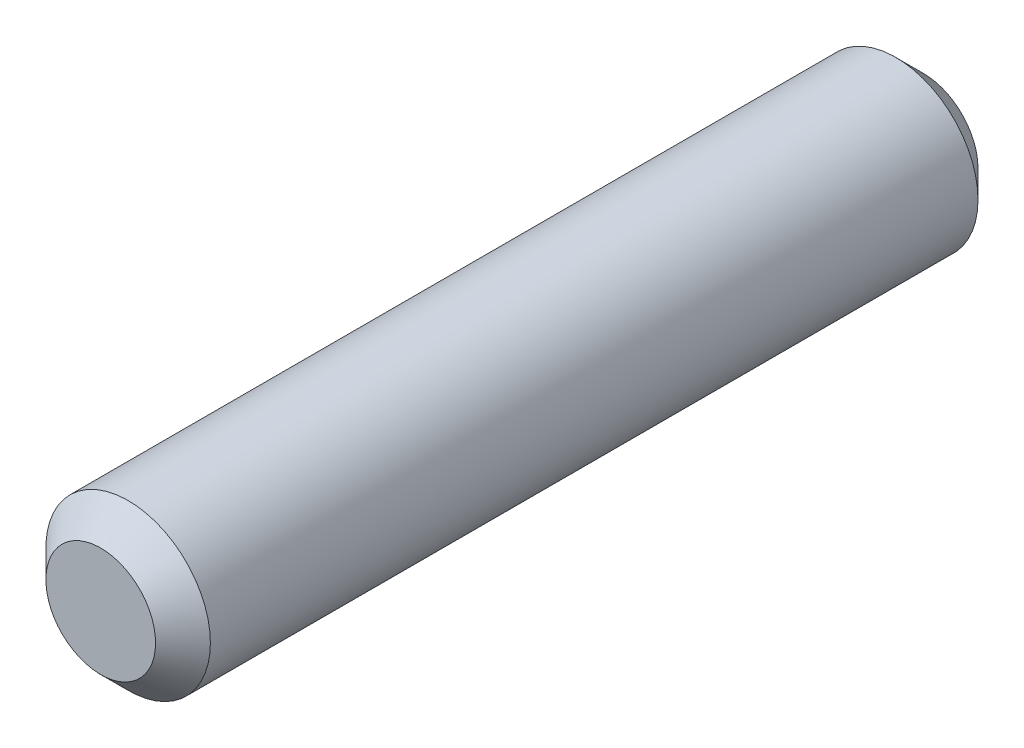
ISO-10303-21;
HEADER;
FILE_DESCRIPTION(('STEP AP214'),'2;1');
FILE_NAME('part.step','',(''),(''),'','','');
FILE_SCHEMA(('AUTOMOTIVE_DESIGN { 1 0 10303 214 1 1 1 1 }'));
ENDSEC;
DATA;
#1=APPLICATION_CONTEXT('core data for automotive mechanical design processes');
#2=APPLICATION_PROTOCOL_DEFINITION('international standard','automotive_design',2000,#1);
#3=PRODUCT_CONTEXT('',#1,'mechanical');
#4=PRODUCT('Part','Part','',(#3));
#5=PRODUCT_RELATED_PRODUCT_CATEGORY('part','',(#4));
#6=PRODUCT_DEFINITION_FORMATION('','',#4);
#7=PRODUCT_DEFINITION_CONTEXT('part definition',#1,'design');
#8=PRODUCT_DEFINITION('design','',#6,#7);
#9=PRODUCT_DEFINITION_SHAPE('','',#8);
#10=(LENGTH_UNIT() NAMED_UNIT(*) SI_UNIT(.MILLI.,.METRE.));
#11=(NAMED_UNIT(*) PLANE_ANGLE_UNIT() SI_UNIT($,.RADIAN.));
#12=(NAMED_UNIT(*) SI_UNIT($,.STERADIAN.) SOLID_ANGLE_UNIT());
#13=UNCERTAINTY_MEASURE_WITH_UNIT(LENGTH_MEASURE(1.E-05),#10,'distance_accuracy_value','');
#14=(GEOMETRIC_REPRESENTATION_CONTEXT(3) GLOBAL_UNCERTAINTY_ASSIGNED_CONTEXT((#13)) GLOBAL_UNIT_ASSIGNED_CONTEXT((#10,
#11,#12)) REPRESENTATION_CONTEXT('',''));
#15=CARTESIAN_POINT('',(0.,0.,0.));
#16=DIRECTION('',(0.,0.,1.));
#17=DIRECTION('',(1.,0.,0.));
#18=AXIS2_PLACEMENT_3D('',#15,#16,#17);
#19=CARTESIAN_POINT('',(0.,0.,15.));
#20=DIRECTION('',(0.,0.,-1.));
#21=DIRECTION('',(-1.,0.,0.));
#22=AXIS2_PLACEMENT_3D('',#19,#20,#21);
#23=CYLINDRICAL_SURFACE('',#22,1.5);
#24=CARTESIAN_POINT('',(0.,0.,14.5));
#25=DIRECTION('',(0.,0.,1.));
#26=DIRECTION('',(1.,0.,0.));
#27=AXIS2_PLACEMENT_3D('',#24,#25,#26);
#28=CIRCLE('',#27,1.5);
#29=CARTESIAN_POINT('',(1.5,0.,14.5));
#30=VERTEX_POINT('',#29);
#31=EDGE_CURVE('E41',#30,#30,#28,.F.);
#32=ORIENTED_EDGE('',*,*,#31,.T.);
#33=EDGE_LOOP('',(#32));
#34=FACE_BOUND('',#33,.T.);
#35=CARTESIAN_POINT('',(0.,0.,0.499999999999999));
#36=DIRECTION('',(0.,0.,1.));
#37=DIRECTION('',(1.,0.,0.));
#38=AXIS2_PLACEMENT_3D('',#35,#36,#37);
#39=CIRCLE('',#38,1.5);
#40=CARTESIAN_POINT('',(1.5,0.,0.499999999999999));
#41=VERTEX_POINT('',#40);
#42=EDGE_CURVE('E45',#41,#41,#39,.T.);
#43=ORIENTED_EDGE('',*,*,#42,.T.);
#44=EDGE_LOOP('',(#43));
#45=FACE_BOUND('',#44,.T.);
#46=ADVANCED_FACE('F33',(#34,#45),#23,.T.);
#47=CARTESIAN_POINT('',(0.,0.,15.));
#48=DIRECTION('',(0.,0.,1.));
#49=DIRECTION('',(1.,0.,0.));
#50=AXIS2_PLACEMENT_3D('',#47,#48,#49);
#51=PLANE('',#50);
#52=CARTESIAN_POINT('',(0.,0.,15.));
#53=DIRECTION('',(0.,0.,1.));
#54=DIRECTION('',(1.,0.,0.));
#55=AXIS2_PLACEMENT_3D('',#52,#53,#54);
#56=CIRCLE('',#55,1.);
#57=CARTESIAN_POINT('',(1.,0.,15.));
#58=VERTEX_POINT('',#57);
#59=EDGE_CURVE('E49',#58,#58,#56,.T.);
#60=ORIENTED_EDGE('',*,*,#59,.T.);
#61=EDGE_LOOP('',(#60));
#62=FACE_BOUND('',#61,.T.);
#63=ADVANCED_FACE('F55',(#62),#51,.T.);
#64=CARTESIAN_POINT('',(0.,0.,0.));
#65=DIRECTION('',(0.,0.,1.));
#66=DIRECTION('',(1.,0.,0.));
#67=AXIS2_PLACEMENT_3D('',#64,#65,#66);
#68=PLANE('',#67);
#69=CARTESIAN_POINT('',(0.,0.,0.));
#70=DIRECTION('',(0.,0.,1.));
#71=DIRECTION('',(1.,0.,0.));
#72=AXIS2_PLACEMENT_3D('',#69,#70,#71);
#73=CIRCLE('',#72,0.999999999999999);
#74=CARTESIAN_POINT('',(0.999999999999999,0.,0.));
#75=VERTEX_POINT('',#74);
#76=EDGE_CURVE('E10',#75,#75,#73,.F.);
#77=ORIENTED_EDGE('',*,*,#76,.T.);
#78=EDGE_LOOP('',(#77));
#79=FACE_BOUND('',#78,.T.);
#80=ADVANCED_FACE('F59',(#79),#68,.F.);
#81=CARTESIAN_POINT('',(0.,0.,15.));
#82=DIRECTION('',(0.,0.,-1.));
#83=DIRECTION('',(-1.,0.,0.));
#84=AXIS2_PLACEMENT_3D('',#81,#82,#83);
#85=CONICAL_SURFACE('',#84,1.,0.785398163397443);
#86=ORIENTED_EDGE('',*,*,#31,.F.);
#87=EDGE_LOOP('',(#86));
#88=FACE_BOUND('',#87,.T.);
#89=ORIENTED_EDGE('',*,*,#59,.F.);
#90=EDGE_LOOP('',(#89));
#91=FACE_BOUND('',#90,.T.);
#92=ADVANCED_FACE('F57',(#88,#91),#85,.T.);
#93=CARTESIAN_POINT('',(0.,0.,0.499999999999999));
#94=DIRECTION('',(0.,0.,1.));
#95=DIRECTION('',(1.,0.,0.));
#96=AXIS2_PLACEMENT_3D('',#93,#94,#95);
#97=CONICAL_SURFACE('',#96,1.5,0.78539816339745);
#98=ORIENTED_EDGE('',*,*,#76,.F.);
#99=EDGE_LOOP('',(#98));
#100=FACE_BOUND('',#99,.T.);
#101=ORIENTED_EDGE('',*,*,#42,.F.);
#102=EDGE_LOOP('',(#101));
#103=FACE_BOUND('',#102,.T.);
#104=ADVANCED_FACE('F36',(#100,#103),#97,.T.);
#105=CLOSED_SHELL('',(#46,#63,#80,#92,#104));
#106=MANIFOLD_SOLID_BREP('B2',#105);
#107=ADVANCED_BREP_SHAPE_REPRESENTATION('',(#18,#106),#14);
#108=SHAPE_DEFINITION_REPRESENTATION(#9,#107);
ENDSEC;
END-ISO-10303-21;
